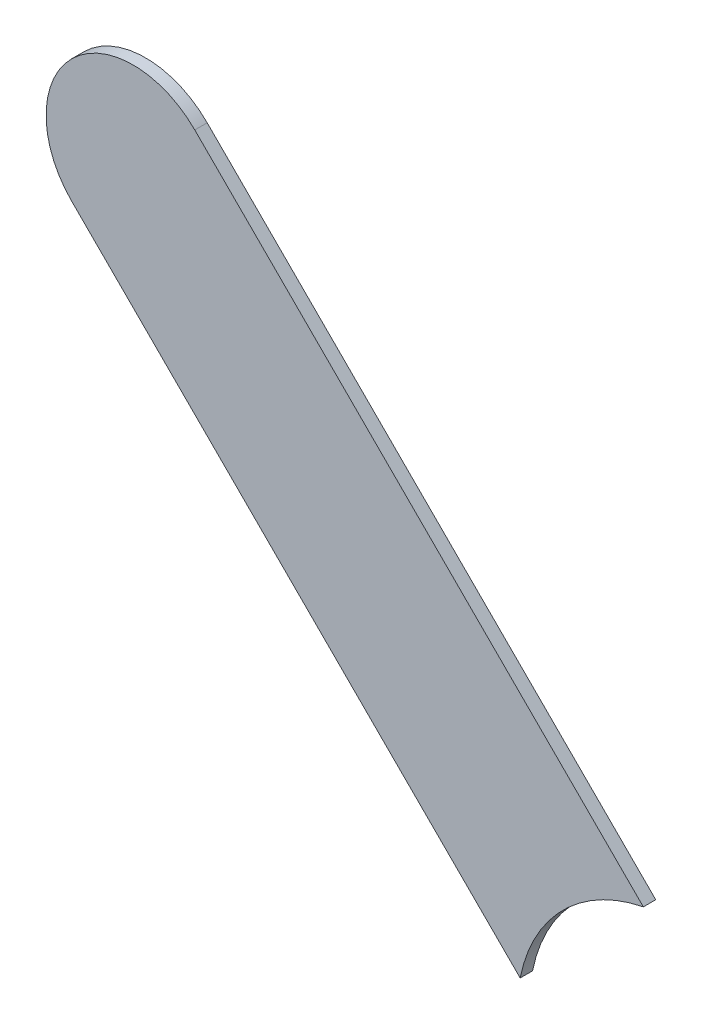
ISO-10303-21;
HEADER;
FILE_DESCRIPTION(('STEP AP214'),'2;1');
FILE_NAME('part.step','',(''),(''),'','','');
FILE_SCHEMA(('AUTOMOTIVE_DESIGN { 1 0 10303 214 1 1 1 1 }'));
ENDSEC;
DATA;
#1=APPLICATION_CONTEXT('core data for automotive mechanical design processes');
#2=APPLICATION_PROTOCOL_DEFINITION('international standard','automotive_design',2000,#1);
#3=PRODUCT_CONTEXT('',#1,'mechanical');
#4=PRODUCT('Part','Part','',(#3));
#5=PRODUCT_RELATED_PRODUCT_CATEGORY('part','',(#4));
#6=PRODUCT_DEFINITION_FORMATION('','',#4);
#7=PRODUCT_DEFINITION_CONTEXT('part definition',#1,'design');
#8=PRODUCT_DEFINITION('design','',#6,#7);
#9=PRODUCT_DEFINITION_SHAPE('','',#8);
#10=(LENGTH_UNIT() NAMED_UNIT(*) SI_UNIT(.MILLI.,.METRE.));
#11=(NAMED_UNIT(*) PLANE_ANGLE_UNIT() SI_UNIT($,.RADIAN.));
#12=(NAMED_UNIT(*) SI_UNIT($,.STERADIAN.) SOLID_ANGLE_UNIT());
#13=UNCERTAINTY_MEASURE_WITH_UNIT(LENGTH_MEASURE(1.E-05),#10,'distance_accuracy_value','');
#14=(GEOMETRIC_REPRESENTATION_CONTEXT(3) GLOBAL_UNCERTAINTY_ASSIGNED_CONTEXT((#13)) GLOBAL_UNIT_ASSIGNED_CONTEXT((#10,
#11,#12)) REPRESENTATION_CONTEXT('',''));
#15=CARTESIAN_POINT('',(0.,0.,0.));
#16=DIRECTION('',(0.,0.,1.));
#17=DIRECTION('',(1.,0.,0.));
#18=AXIS2_PLACEMENT_3D('',#15,#16,#17);
#19=CARTESIAN_POINT('',(89.56223896,113.32322268,0.));
#20=DIRECTION('',(0.707106781186548,0.707106781186548,0.));
#21=DIRECTION('',(0.707106781186548,-0.707106781186548,0.));
#22=AXIS2_PLACEMENT_3D('',#19,#20,#21);
#23=PLANE('',#22);
#24=DIRECTION('',(0.707106781186548,-0.707106781186548,0.));
#25=VECTOR('',#24,1.);
#26=CARTESIAN_POINT('',(89.56223896,113.32322268,0.03556));
#27=LINE('',#26,#25);
#28=CARTESIAN_POINT('',(89.56223896,113.32322268,0.03556));
#29=VERTEX_POINT('',#28);
#30=CARTESIAN_POINT('',(90.8496526436052,112.035808996395,0.03556));
#31=VERTEX_POINT('',#30);
#32=EDGE_CURVE('E11',#29,#31,#27,.T.);
#33=ORIENTED_EDGE('',*,*,#32,.F.);
#34=DIRECTION('',(0.,0.,1.));
#35=VECTOR('',#34,1.);
#36=CARTESIAN_POINT('',(89.56223896,113.32322268,0.));
#37=LINE('',#36,#35);
#38=CARTESIAN_POINT('',(89.56223896,113.32322268,0.));
#39=VERTEX_POINT('',#38);
#40=EDGE_CURVE('E24',#39,#29,#37,.T.);
#41=ORIENTED_EDGE('',*,*,#40,.F.);
#42=DIRECTION('',(0.707106781186548,-0.707106781186548,0.));
#43=VECTOR('',#42,1.);
#44=CARTESIAN_POINT('',(89.56223896,113.32322268,0.));
#45=LINE('',#44,#43);
#46=CARTESIAN_POINT('',(90.8496526436052,112.035808996395,0.));
#47=VERTEX_POINT('',#46);
#48=EDGE_CURVE('E75',#39,#47,#45,.T.);
#49=ORIENTED_EDGE('',*,*,#48,.T.);
#50=DIRECTION('',(0.,0.,1.));
#51=VECTOR('',#50,1.);
#52=CARTESIAN_POINT('',(90.8496526436052,112.035808996395,0.));
#53=LINE('',#52,#51);
#54=EDGE_CURVE('E37',#47,#31,#53,.T.);
#55=ORIENTED_EDGE('',*,*,#54,.T.);
#56=EDGE_LOOP('',(#33,#41,#49,#55));
#57=FACE_BOUND('',#56,.T.);
#58=ADVANCED_FACE('F17',(#57),#23,.F.);
#59=CARTESIAN_POINT('',(91.2910036,111.9480108,0.));
#60=DIRECTION('',(0.,0.,-1.));
#61=DIRECTION('',(1.,0.,0.));
#62=AXIS2_PLACEMENT_3D('',#59,#60,#61);
#63=CYLINDRICAL_SURFACE('',#62,0.4499991);
#64=DIRECTION('',(0.,0.,1.));
#65=VECTOR('',#64,1.);
#66=CARTESIAN_POINT('',(91.2032054036052,112.389361756395,0.));
#67=LINE('',#66,#65);
#68=CARTESIAN_POINT('',(91.2032054036052,112.389361756395,0.));
#69=VERTEX_POINT('',#68);
#70=CARTESIAN_POINT('',(91.2032054036052,112.389361756395,0.03556));
#71=VERTEX_POINT('',#70);
#72=EDGE_CURVE('E67',#69,#71,#67,.T.);
#73=ORIENTED_EDGE('',*,*,#72,.T.);
#74=CARTESIAN_POINT('',(91.2910036,111.9480108,0.03556));
#75=DIRECTION('',(0.,0.,1.));
#76=DIRECTION('',(1.,0.,0.));
#77=AXIS2_PLACEMENT_3D('',#74,#75,#76);
#78=CIRCLE('',#77,0.4499991);
#79=EDGE_CURVE('E82',#71,#31,#78,.T.);
#80=ORIENTED_EDGE('',*,*,#79,.T.);
#81=ORIENTED_EDGE('',*,*,#54,.F.);
#82=CARTESIAN_POINT('',(91.2910036,111.9480108,0.));
#83=DIRECTION('',(0.,0.,1.));
#84=DIRECTION('',(1.,0.,0.));
#85=AXIS2_PLACEMENT_3D('',#82,#83,#84);
#86=CIRCLE('',#85,0.4499991);
#87=EDGE_CURVE('E80',#69,#47,#86,.T.);
#88=ORIENTED_EDGE('',*,*,#87,.F.);
#89=EDGE_LOOP('',(#73,#80,#81,#88));
#90=FACE_BOUND('',#89,.T.);
#91=ADVANCED_FACE('F88',(#90),#63,.F.);
#92=CARTESIAN_POINT('',(91.2032054036052,112.389361756395,0.));
#93=DIRECTION('',(-0.707106781186551,-0.707106781186544,0.));
#94=DIRECTION('',(-0.707106781186544,0.707106781186551,0.));
#95=AXIS2_PLACEMENT_3D('',#92,#93,#94);
#96=PLANE('',#95);
#97=DIRECTION('',(-0.707106781186544,0.707106781186551,0.));
#98=VECTOR('',#97,1.);
#99=CARTESIAN_POINT('',(91.46777998,112.12478718,0.03556));
#100=LINE('',#99,#98);
#101=CARTESIAN_POINT('',(89.91579172,113.67677544,0.03556));
#102=VERTEX_POINT('',#101);
#103=EDGE_CURVE('E71',#71,#102,#100,.T.);
#104=ORIENTED_EDGE('',*,*,#103,.F.);
#105=ORIENTED_EDGE('',*,*,#72,.F.);
#106=DIRECTION('',(-0.707106781186544,0.707106781186551,0.));
#107=VECTOR('',#106,1.);
#108=CARTESIAN_POINT('',(91.46777998,112.12478718,0.));
#109=LINE('',#108,#107);
#110=CARTESIAN_POINT('',(89.91579172,113.67677544,0.));
#111=VERTEX_POINT('',#110);
#112=EDGE_CURVE('E63',#69,#111,#109,.T.);
#113=ORIENTED_EDGE('',*,*,#112,.T.);
#114=DIRECTION('',(0.,0.,1.));
#115=VECTOR('',#114,1.);
#116=CARTESIAN_POINT('',(89.91579172,113.67677544,0.));
#117=LINE('',#116,#115);
#118=EDGE_CURVE('E53',#111,#102,#117,.T.);
#119=ORIENTED_EDGE('',*,*,#118,.T.);
#120=EDGE_LOOP('',(#104,#105,#113,#119));
#121=FACE_BOUND('',#120,.T.);
#122=ADVANCED_FACE('F66',(#121),#96,.F.);
#123=CARTESIAN_POINT('',(89.73901534,113.49999906,0.));
#124=DIRECTION('',(0.,0.,-1.));
#125=DIRECTION('',(0.707106781186519,0.707106781186576,0.));
#126=AXIS2_PLACEMENT_3D('',#123,#124,#125);
#127=CYLINDRICAL_SURFACE('',#126,0.249999554103216);
#128=CARTESIAN_POINT('',(89.73901534,113.49999906,0.03556));
#129=DIRECTION('',(0.,0.,1.));
#130=DIRECTION('',(0.707106781186519,0.707106781186576,0.));
#131=AXIS2_PLACEMENT_3D('',#128,#129,#130);
#132=CIRCLE('',#131,0.249999554103216);
#133=EDGE_CURVE('E59',#102,#29,#132,.T.);
#134=ORIENTED_EDGE('',*,*,#133,.F.);
#135=ORIENTED_EDGE('',*,*,#118,.F.);
#136=CARTESIAN_POINT('',(89.73901534,113.49999906,0.));
#137=DIRECTION('',(0.,0.,1.));
#138=DIRECTION('',(0.707106781186519,0.707106781186576,0.));
#139=AXIS2_PLACEMENT_3D('',#136,#137,#138);
#140=CIRCLE('',#139,0.249999554103216);
#141=EDGE_CURVE('E57',#111,#39,#140,.T.);
#142=ORIENTED_EDGE('',*,*,#141,.T.);
#143=ORIENTED_EDGE('',*,*,#40,.T.);
#144=EDGE_LOOP('',(#134,#135,#142,#143));
#145=FACE_BOUND('',#144,.T.);
#146=ADVANCED_FACE('F55',(#145),#127,.T.);
#147=CARTESIAN_POINT('',(89.56223896,113.32322268,0.));
#148=DIRECTION('',(0.,0.,-1.));
#149=DIRECTION('',(-1.,0.,0.));
#150=AXIS2_PLACEMENT_3D('',#147,#148,#149);
#151=PLANE('',#150);
#152=ORIENTED_EDGE('',*,*,#48,.F.);
#153=ORIENTED_EDGE('',*,*,#141,.F.);
#154=ORIENTED_EDGE('',*,*,#112,.F.);
#155=ORIENTED_EDGE('',*,*,#87,.T.);
#156=EDGE_LOOP('',(#152,#153,#154,#155));
#157=FACE_BOUND('',#156,.T.);
#158=ADVANCED_FACE('F74',(#157),#151,.T.);
#159=CARTESIAN_POINT('',(89.56223896,113.32322268,0.03556));
#160=DIRECTION('',(0.,0.,-1.));
#161=DIRECTION('',(-1.,0.,0.));
#162=AXIS2_PLACEMENT_3D('',#159,#160,#161);
#163=PLANE('',#162);
#164=ORIENTED_EDGE('',*,*,#133,.T.);
#165=ORIENTED_EDGE('',*,*,#32,.T.);
#166=ORIENTED_EDGE('',*,*,#79,.F.);
#167=ORIENTED_EDGE('',*,*,#103,.T.);
#168=EDGE_LOOP('',(#164,#165,#166,#167));
#169=FACE_BOUND('',#168,.T.);
#170=ADVANCED_FACE('F91',(#169),#163,.F.);
#171=CLOSED_SHELL('',(#58,#91,#122,#146,#158,#170));
#172=MANIFOLD_SOLID_BREP('B1',#171);
#173=ADVANCED_BREP_SHAPE_REPRESENTATION('',(#18,#172),#14);
#174=SHAPE_DEFINITION_REPRESENTATION(#9,#173);
ENDSEC;
END-ISO-10303-21;
